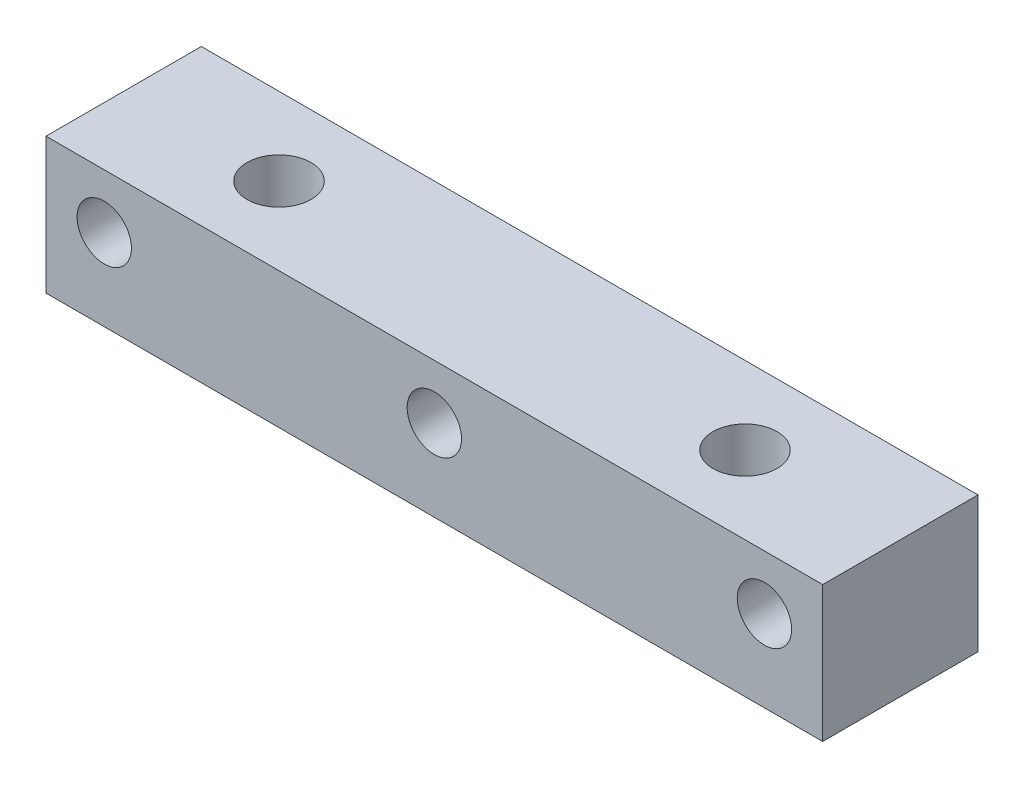
ISO-10303-21;
HEADER;
FILE_DESCRIPTION(('STEP AP214'),'2;1');
FILE_NAME('part.step','',(''),(''),'','','');
FILE_SCHEMA(('AUTOMOTIVE_DESIGN { 1 0 10303 214 1 1 1 1 }'));
ENDSEC;
DATA;
#1=APPLICATION_CONTEXT('core data for automotive mechanical design processes');
#2=APPLICATION_PROTOCOL_DEFINITION('international standard','automotive_design',2000,#1);
#3=PRODUCT_CONTEXT('',#1,'mechanical');
#4=PRODUCT('Part','Part','',(#3));
#5=PRODUCT_RELATED_PRODUCT_CATEGORY('part','',(#4));
#6=PRODUCT_DEFINITION_FORMATION('','',#4);
#7=PRODUCT_DEFINITION_CONTEXT('part definition',#1,'design');
#8=PRODUCT_DEFINITION('design','',#6,#7);
#9=PRODUCT_DEFINITION_SHAPE('','',#8);
#10=(LENGTH_UNIT() NAMED_UNIT(*) SI_UNIT(.MILLI.,.METRE.));
#11=(NAMED_UNIT(*) PLANE_ANGLE_UNIT() SI_UNIT($,.RADIAN.));
#12=(NAMED_UNIT(*) SI_UNIT($,.STERADIAN.) SOLID_ANGLE_UNIT());
#13=UNCERTAINTY_MEASURE_WITH_UNIT(LENGTH_MEASURE(1.E-05),#10,'distance_accuracy_value','');
#14=(GEOMETRIC_REPRESENTATION_CONTEXT(3) GLOBAL_UNCERTAINTY_ASSIGNED_CONTEXT((#13)) GLOBAL_UNIT_ASSIGNED_CONTEXT((#10,
#11,#12)) REPRESENTATION_CONTEXT('',''));
#15=CARTESIAN_POINT('',(0.,0.,0.));
#16=DIRECTION('',(0.,0.,1.));
#17=DIRECTION('',(1.,0.,0.));
#18=AXIS2_PLACEMENT_3D('',#15,#16,#17);
#19=CARTESIAN_POINT('',(0.,0.,8.));
#20=DIRECTION('',(1.,0.,0.));
#21=DIRECTION('',(0.,0.,-1.));
#22=AXIS2_PLACEMENT_3D('',#19,#20,#21);
#23=PLANE('',#22);
#24=DIRECTION('',(0.,-1.,0.));
#25=VECTOR('',#24,1.);
#26=CARTESIAN_POINT('',(0.,0.,0.));
#27=LINE('',#26,#25);
#28=CARTESIAN_POINT('',(0.,7.,0.));
#29=VERTEX_POINT('',#28);
#30=CARTESIAN_POINT('',(0.,0.,0.));
#31=VERTEX_POINT('',#30);
#32=EDGE_CURVE('E96',#29,#31,#27,.T.);
#33=ORIENTED_EDGE('',*,*,#32,.T.);
#34=DIRECTION('',(0.,0.,-1.));
#35=VECTOR('',#34,1.);
#36=CARTESIAN_POINT('',(0.,0.,8.));
#37=LINE('',#36,#35);
#38=CARTESIAN_POINT('',(0.,0.,8.));
#39=VERTEX_POINT('',#38);
#40=EDGE_CURVE('E11',#39,#31,#37,.T.);
#41=ORIENTED_EDGE('',*,*,#40,.F.);
#42=DIRECTION('',(0.,-1.,0.));
#43=VECTOR('',#42,1.);
#44=CARTESIAN_POINT('',(0.,0.,8.));
#45=LINE('',#44,#43);
#46=CARTESIAN_POINT('',(0.,7.,8.));
#47=VERTEX_POINT('',#46);
#48=EDGE_CURVE('E84',#47,#39,#45,.T.);
#49=ORIENTED_EDGE('',*,*,#48,.F.);
#50=DIRECTION('',(0.,0.,-1.));
#51=VECTOR('',#50,1.);
#52=CARTESIAN_POINT('',(0.,7.,8.));
#53=LINE('',#52,#51);
#54=EDGE_CURVE('E92',#47,#29,#53,.T.);
#55=ORIENTED_EDGE('',*,*,#54,.T.);
#56=EDGE_LOOP('',(#33,#41,#49,#55));
#57=FACE_BOUND('',#56,.T.);
#58=ADVANCED_FACE('F33',(#57),#23,.F.);
#59=CARTESIAN_POINT('',(0.,0.,8.));
#60=DIRECTION('',(0.,1.,0.));
#61=DIRECTION('',(0.,0.,1.));
#62=AXIS2_PLACEMENT_3D('',#59,#60,#61);
#63=PLANE('',#62);
#64=CARTESIAN_POINT('',(32.,0.,4.));
#65=DIRECTION('',(0.,1.,0.));
#66=DIRECTION('',(0.,0.,-1.));
#67=AXIS2_PLACEMENT_3D('',#64,#65,#66);
#68=CIRCLE('',#67,1.65);
#69=CARTESIAN_POINT('',(32.,0.,2.35));
#70=VERTEX_POINT('',#69);
#71=EDGE_CURVE('E131',#70,#70,#68,.T.);
#72=ORIENTED_EDGE('',*,*,#71,.T.);
#73=EDGE_LOOP('',(#72));
#74=FACE_BOUND('',#73,.T.);
#75=CARTESIAN_POINT('',(8.,0.,4.));
#76=DIRECTION('',(0.,1.,0.));
#77=DIRECTION('',(0.,0.,1.));
#78=AXIS2_PLACEMENT_3D('',#75,#76,#77);
#79=CIRCLE('',#78,1.65);
#80=CARTESIAN_POINT('',(8.,0.,5.65));
#81=VERTEX_POINT('',#80);
#82=EDGE_CURVE('E120',#81,#81,#79,.T.);
#83=ORIENTED_EDGE('',*,*,#82,.T.);
#84=EDGE_LOOP('',(#83));
#85=FACE_BOUND('',#84,.T.);
#86=DIRECTION('',(1.,0.,0.));
#87=VECTOR('',#86,1.);
#88=CARTESIAN_POINT('',(0.,0.,0.));
#89=LINE('',#88,#87);
#90=CARTESIAN_POINT('',(40.,0.,0.));
#91=VERTEX_POINT('',#90);
#92=EDGE_CURVE('E88',#31,#91,#89,.T.);
#93=ORIENTED_EDGE('',*,*,#92,.T.);
#94=DIRECTION('',(0.,0.,-1.));
#95=VECTOR('',#94,1.);
#96=CARTESIAN_POINT('',(40.,0.,8.));
#97=LINE('',#96,#95);
#98=CARTESIAN_POINT('',(40.,0.,8.));
#99=VERTEX_POINT('',#98);
#100=EDGE_CURVE('E41',#99,#91,#97,.T.);
#101=ORIENTED_EDGE('',*,*,#100,.F.);
#102=DIRECTION('',(1.,0.,0.));
#103=VECTOR('',#102,1.);
#104=CARTESIAN_POINT('',(0.,0.,8.));
#105=LINE('',#104,#103);
#106=EDGE_CURVE('E79',#39,#99,#105,.T.);
#107=ORIENTED_EDGE('',*,*,#106,.F.);
#108=ORIENTED_EDGE('',*,*,#40,.T.);
#109=EDGE_LOOP('',(#93,#101,#107,#108));
#110=FACE_BOUND('',#109,.T.);
#111=ADVANCED_FACE('F87',(#74,#85,#110),#63,.F.);
#112=CARTESIAN_POINT('',(40.,0.,8.));
#113=DIRECTION('',(-1.,0.,0.));
#114=DIRECTION('',(0.,0.,1.));
#115=AXIS2_PLACEMENT_3D('',#112,#113,#114);
#116=PLANE('',#115);
#117=DIRECTION('',(0.,1.,0.));
#118=VECTOR('',#117,1.);
#119=CARTESIAN_POINT('',(40.,0.,0.));
#120=LINE('',#119,#118);
#121=CARTESIAN_POINT('',(40.,7.,0.));
#122=VERTEX_POINT('',#121);
#123=EDGE_CURVE('E66',#91,#122,#120,.T.);
#124=ORIENTED_EDGE('',*,*,#123,.T.);
#125=DIRECTION('',(0.,0.,-1.));
#126=VECTOR('',#125,1.);
#127=CARTESIAN_POINT('',(40.,7.,8.));
#128=LINE('',#127,#126);
#129=CARTESIAN_POINT('',(40.,7.,8.));
#130=VERTEX_POINT('',#129);
#131=EDGE_CURVE('E89',#130,#122,#128,.T.);
#132=ORIENTED_EDGE('',*,*,#131,.F.);
#133=DIRECTION('',(0.,1.,0.));
#134=VECTOR('',#133,1.);
#135=CARTESIAN_POINT('',(40.,0.,8.));
#136=LINE('',#135,#134);
#137=EDGE_CURVE('E82',#99,#130,#136,.T.);
#138=ORIENTED_EDGE('',*,*,#137,.F.);
#139=ORIENTED_EDGE('',*,*,#100,.T.);
#140=EDGE_LOOP('',(#124,#132,#138,#139));
#141=FACE_BOUND('',#140,.T.);
#142=ADVANCED_FACE('F90',(#141),#116,.F.);
#143=CARTESIAN_POINT('',(0.,7.,8.));
#144=DIRECTION('',(0.,-1.,0.));
#145=DIRECTION('',(0.,0.,-1.));
#146=AXIS2_PLACEMENT_3D('',#143,#144,#145);
#147=PLANE('',#146);
#148=CARTESIAN_POINT('',(32.,7.,4.));
#149=DIRECTION('',(0.,1.,0.));
#150=DIRECTION('',(0.,0.,-1.));
#151=AXIS2_PLACEMENT_3D('',#148,#149,#150);
#152=CIRCLE('',#151,1.65);
#153=CARTESIAN_POINT('',(32.,7.,2.35));
#154=VERTEX_POINT('',#153);
#155=EDGE_CURVE('E134',#154,#154,#152,.T.);
#156=ORIENTED_EDGE('',*,*,#155,.F.);
#157=EDGE_LOOP('',(#156));
#158=FACE_BOUND('',#157,.T.);
#159=CARTESIAN_POINT('',(8.,7.,4.));
#160=DIRECTION('',(0.,1.,0.));
#161=DIRECTION('',(0.,0.,1.));
#162=AXIS2_PLACEMENT_3D('',#159,#160,#161);
#163=CIRCLE('',#162,1.65);
#164=CARTESIAN_POINT('',(8.,7.,5.65));
#165=VERTEX_POINT('',#164);
#166=EDGE_CURVE('E128',#165,#165,#163,.T.);
#167=ORIENTED_EDGE('',*,*,#166,.F.);
#168=EDGE_LOOP('',(#167));
#169=FACE_BOUND('',#168,.T.);
#170=DIRECTION('',(-1.,0.,0.));
#171=VECTOR('',#170,1.);
#172=CARTESIAN_POINT('',(0.,7.,0.));
#173=LINE('',#172,#171);
#174=EDGE_CURVE('E72',#122,#29,#173,.T.);
#175=ORIENTED_EDGE('',*,*,#174,.T.);
#176=ORIENTED_EDGE('',*,*,#54,.F.);
#177=DIRECTION('',(-1.,0.,0.));
#178=VECTOR('',#177,1.);
#179=CARTESIAN_POINT('',(0.,7.,8.));
#180=LINE('',#179,#178);
#181=EDGE_CURVE('E49',#130,#47,#180,.T.);
#182=ORIENTED_EDGE('',*,*,#181,.F.);
#183=ORIENTED_EDGE('',*,*,#131,.T.);
#184=EDGE_LOOP('',(#175,#176,#182,#183));
#185=FACE_BOUND('',#184,.T.);
#186=ADVANCED_FACE('F104',(#158,#169,#185),#147,.F.);
#187=CARTESIAN_POINT('',(0.,0.,8.));
#188=DIRECTION('',(0.,0.,-1.));
#189=DIRECTION('',(-1.,0.,0.));
#190=AXIS2_PLACEMENT_3D('',#187,#188,#189);
#191=PLANE('',#190);
#192=CARTESIAN_POINT('',(3.,4.2,8.));
#193=DIRECTION('',(0.,0.,1.));
#194=DIRECTION('',(1.,0.,0.));
#195=AXIS2_PLACEMENT_3D('',#192,#193,#194);
#196=CIRCLE('',#195,1.4);
#197=CARTESIAN_POINT('',(4.4,4.2,8.));
#198=VERTEX_POINT('',#197);
#199=EDGE_CURVE('E123',#198,#198,#196,.T.);
#200=ORIENTED_EDGE('',*,*,#199,.F.);
#201=EDGE_LOOP('',(#200));
#202=FACE_BOUND('',#201,.T.);
#203=CARTESIAN_POINT('',(37.,4.2,8.));
#204=DIRECTION('',(0.,0.,1.));
#205=DIRECTION('',(-1.,0.,0.));
#206=AXIS2_PLACEMENT_3D('',#203,#204,#205);
#207=CIRCLE('',#206,1.4);
#208=CARTESIAN_POINT('',(35.6,4.2,8.));
#209=VERTEX_POINT('',#208);
#210=EDGE_CURVE('E116',#209,#209,#207,.T.);
#211=ORIENTED_EDGE('',*,*,#210,.F.);
#212=EDGE_LOOP('',(#211));
#213=FACE_BOUND('',#212,.T.);
#214=CARTESIAN_POINT('',(20.,4.2,8.));
#215=DIRECTION('',(0.,0.,1.));
#216=DIRECTION('',(1.,0.,0.));
#217=AXIS2_PLACEMENT_3D('',#214,#215,#216);
#218=CIRCLE('',#217,1.4);
#219=CARTESIAN_POINT('',(21.4,4.2,8.));
#220=VERTEX_POINT('',#219);
#221=EDGE_CURVE('E110',#220,#220,#218,.T.);
#222=ORIENTED_EDGE('',*,*,#221,.F.);
#223=EDGE_LOOP('',(#222));
#224=FACE_BOUND('',#223,.T.);
#225=ORIENTED_EDGE('',*,*,#48,.T.);
#226=ORIENTED_EDGE('',*,*,#106,.T.);
#227=ORIENTED_EDGE('',*,*,#137,.T.);
#228=ORIENTED_EDGE('',*,*,#181,.T.);
#229=EDGE_LOOP('',(#225,#226,#227,#228));
#230=FACE_BOUND('',#229,.T.);
#231=ADVANCED_FACE('F80',(#202,#213,#224,#230),#191,.F.);
#232=CARTESIAN_POINT('',(0.,0.,0.));
#233=DIRECTION('',(0.,0.,-1.));
#234=DIRECTION('',(-1.,0.,0.));
#235=AXIS2_PLACEMENT_3D('',#232,#233,#234);
#236=PLANE('',#235);
#237=CARTESIAN_POINT('',(3.,4.2,0.));
#238=DIRECTION('',(0.,0.,1.));
#239=DIRECTION('',(1.,0.,0.));
#240=AXIS2_PLACEMENT_3D('',#237,#238,#239);
#241=CIRCLE('',#240,1.4);
#242=CARTESIAN_POINT('',(4.4,4.2,0.));
#243=VERTEX_POINT('',#242);
#244=EDGE_CURVE('E113',#243,#243,#241,.T.);
#245=ORIENTED_EDGE('',*,*,#244,.T.);
#246=EDGE_LOOP('',(#245));
#247=FACE_BOUND('',#246,.T.);
#248=CARTESIAN_POINT('',(37.,4.2,0.));
#249=DIRECTION('',(0.,0.,1.));
#250=DIRECTION('',(-1.,0.,0.));
#251=AXIS2_PLACEMENT_3D('',#248,#249,#250);
#252=CIRCLE('',#251,1.4);
#253=CARTESIAN_POINT('',(35.6,4.2,0.));
#254=VERTEX_POINT('',#253);
#255=EDGE_CURVE('E119',#254,#254,#252,.T.);
#256=ORIENTED_EDGE('',*,*,#255,.T.);
#257=EDGE_LOOP('',(#256));
#258=FACE_BOUND('',#257,.T.);
#259=CARTESIAN_POINT('',(20.,4.2,0.));
#260=DIRECTION('',(0.,0.,1.));
#261=DIRECTION('',(1.,0.,0.));
#262=AXIS2_PLACEMENT_3D('',#259,#260,#261);
#263=CIRCLE('',#262,1.4);
#264=CARTESIAN_POINT('',(21.4,4.2,0.));
#265=VERTEX_POINT('',#264);
#266=EDGE_CURVE('E99',#265,#265,#263,.T.);
#267=ORIENTED_EDGE('',*,*,#266,.T.);
#268=EDGE_LOOP('',(#267));
#269=FACE_BOUND('',#268,.T.);
#270=ORIENTED_EDGE('',*,*,#32,.F.);
#271=ORIENTED_EDGE('',*,*,#174,.F.);
#272=ORIENTED_EDGE('',*,*,#123,.F.);
#273=ORIENTED_EDGE('',*,*,#92,.F.);
#274=EDGE_LOOP('',(#270,#271,#272,#273));
#275=FACE_BOUND('',#274,.T.);
#276=ADVANCED_FACE('F107',(#247,#258,#269,#275),#236,.T.);
#277=CARTESIAN_POINT('',(20.,4.2,0.));
#278=DIRECTION('',(0.,0.,1.));
#279=DIRECTION('',(1.,0.,0.));
#280=AXIS2_PLACEMENT_3D('',#277,#278,#279);
#281=CYLINDRICAL_SURFACE('',#280,1.4);
#282=ORIENTED_EDGE('',*,*,#266,.F.);
#283=EDGE_LOOP('',(#282));
#284=FACE_BOUND('',#283,.T.);
#285=ORIENTED_EDGE('',*,*,#221,.T.);
#286=EDGE_LOOP('',(#285));
#287=FACE_BOUND('',#286,.T.);
#288=ADVANCED_FACE('F176',(#284,#287),#281,.F.);
#289=CARTESIAN_POINT('',(37.,4.2,0.));
#290=DIRECTION('',(0.,0.,1.));
#291=DIRECTION('',(1.,0.,0.));
#292=AXIS2_PLACEMENT_3D('',#289,#290,#291);
#293=CYLINDRICAL_SURFACE('',#292,1.4);
#294=ORIENTED_EDGE('',*,*,#255,.F.);
#295=EDGE_LOOP('',(#294));
#296=FACE_BOUND('',#295,.T.);
#297=ORIENTED_EDGE('',*,*,#210,.T.);
#298=EDGE_LOOP('',(#297));
#299=FACE_BOUND('',#298,.T.);
#300=ADVANCED_FACE('F161',(#296,#299),#293,.F.);
#301=CARTESIAN_POINT('',(3.,4.2,0.));
#302=DIRECTION('',(0.,0.,1.));
#303=DIRECTION('',(1.,0.,0.));
#304=AXIS2_PLACEMENT_3D('',#301,#302,#303);
#305=CYLINDRICAL_SURFACE('',#304,1.4);
#306=ORIENTED_EDGE('',*,*,#244,.F.);
#307=EDGE_LOOP('',(#306));
#308=FACE_BOUND('',#307,.T.);
#309=ORIENTED_EDGE('',*,*,#199,.T.);
#310=EDGE_LOOP('',(#309));
#311=FACE_BOUND('',#310,.T.);
#312=ADVANCED_FACE('F155',(#308,#311),#305,.F.);
#313=CARTESIAN_POINT('',(8.,0.,4.));
#314=DIRECTION('',(0.,1.,0.));
#315=DIRECTION('',(0.,0.,1.));
#316=AXIS2_PLACEMENT_3D('',#313,#314,#315);
#317=CYLINDRICAL_SURFACE('',#316,1.65);
#318=ORIENTED_EDGE('',*,*,#82,.F.);
#319=EDGE_LOOP('',(#318));
#320=FACE_BOUND('',#319,.T.);
#321=ORIENTED_EDGE('',*,*,#166,.T.);
#322=EDGE_LOOP('',(#321));
#323=FACE_BOUND('',#322,.T.);
#324=ADVANCED_FACE('F145',(#320,#323),#317,.F.);
#325=CARTESIAN_POINT('',(32.,0.,4.));
#326=DIRECTION('',(0.,1.,0.));
#327=DIRECTION('',(0.,0.,1.));
#328=AXIS2_PLACEMENT_3D('',#325,#326,#327);
#329=CYLINDRICAL_SURFACE('',#328,1.65);
#330=ORIENTED_EDGE('',*,*,#71,.F.);
#331=EDGE_LOOP('',(#330));
#332=FACE_BOUND('',#331,.T.);
#333=ORIENTED_EDGE('',*,*,#155,.T.);
#334=EDGE_LOOP('',(#333));
#335=FACE_BOUND('',#334,.T.);
#336=ADVANCED_FACE('F142',(#332,#335),#329,.F.);
#337=CLOSED_SHELL('',(#58,#111,#142,#186,#231,#276,#288,#300,#312,#324,#336));
#338=MANIFOLD_SOLID_BREP('B2',#337);
#339=ADVANCED_BREP_SHAPE_REPRESENTATION('',(#18,#338),#14);
#340=SHAPE_DEFINITION_REPRESENTATION(#9,#339);
ENDSEC;
END-ISO-10303-21;
